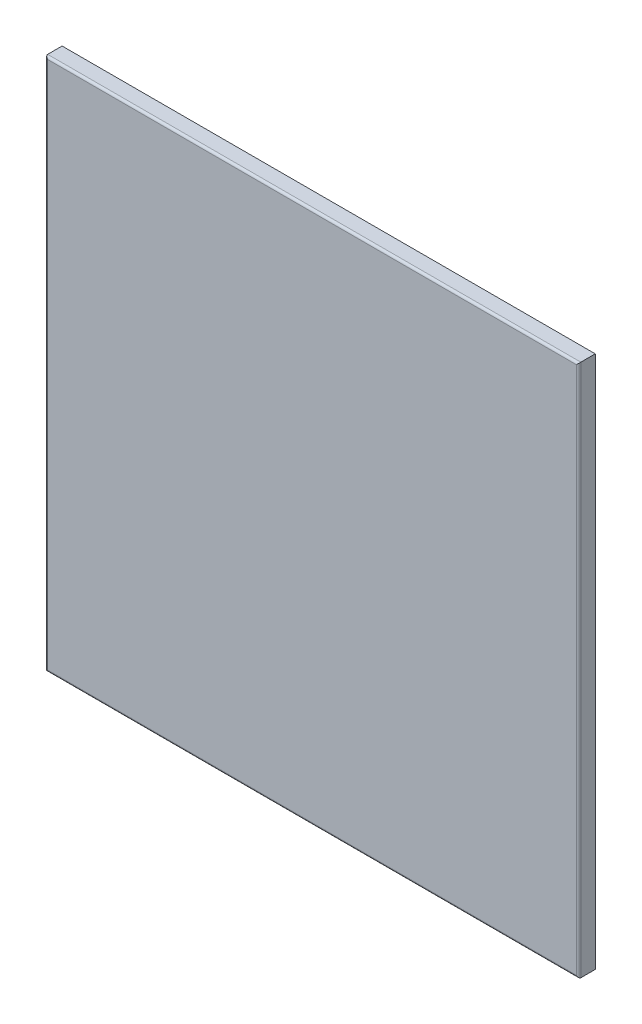
ISO-10303-21;
HEADER;
FILE_DESCRIPTION(('STEP AP214'),'2;1');
FILE_NAME('part.step','',(''),(''),'','','');
FILE_SCHEMA(('AUTOMOTIVE_DESIGN { 1 0 10303 214 1 1 1 1 }'));
ENDSEC;
DATA;
#1=APPLICATION_CONTEXT('core data for automotive mechanical design processes');
#2=APPLICATION_PROTOCOL_DEFINITION('international standard','automotive_design',2000,#1);
#3=PRODUCT_CONTEXT('',#1,'mechanical');
#4=PRODUCT('Part','Part','',(#3));
#5=PRODUCT_RELATED_PRODUCT_CATEGORY('part','',(#4));
#6=PRODUCT_DEFINITION_FORMATION('','',#4);
#7=PRODUCT_DEFINITION_CONTEXT('part definition',#1,'design');
#8=PRODUCT_DEFINITION('design','',#6,#7);
#9=PRODUCT_DEFINITION_SHAPE('','',#8);
#10=(LENGTH_UNIT() NAMED_UNIT(*) SI_UNIT(.MILLI.,.METRE.));
#11=(NAMED_UNIT(*) PLANE_ANGLE_UNIT() SI_UNIT($,.RADIAN.));
#12=(NAMED_UNIT(*) SI_UNIT($,.STERADIAN.) SOLID_ANGLE_UNIT());
#13=UNCERTAINTY_MEASURE_WITH_UNIT(LENGTH_MEASURE(1.E-05),#10,'distance_accuracy_value','');
#14=(GEOMETRIC_REPRESENTATION_CONTEXT(3) GLOBAL_UNCERTAINTY_ASSIGNED_CONTEXT((#13)) GLOBAL_UNIT_ASSIGNED_CONTEXT((#10,
#11,#12)) REPRESENTATION_CONTEXT('',''));
#15=CARTESIAN_POINT('',(0.,0.,0.));
#16=DIRECTION('',(0.,0.,1.));
#17=DIRECTION('',(1.,0.,0.));
#18=AXIS2_PLACEMENT_3D('',#15,#16,#17);
#19=CARTESIAN_POINT('',(304.8,304.8,2.54));
#20=DIRECTION('',(-1.,0.,0.));
#21=DIRECTION('',(0.,-1.,0.));
#22=AXIS2_PLACEMENT_3D('',#19,#20,#21);
#23=PLANE('',#22);
#24=DIRECTION('',(0.,0.,-1.));
#25=VECTOR('',#24,1.);
#26=CARTESIAN_POINT('',(304.8,304.8,2.54));
#27=LINE('',#26,#25);
#28=CARTESIAN_POINT('',(304.8,304.8,0.));
#29=VERTEX_POINT('',#28);
#30=CARTESIAN_POINT('',(304.8,304.8,-16.51));
#31=VERTEX_POINT('',#30);
#32=EDGE_CURVE('E167',#29,#31,#27,.T.);
#33=ORIENTED_EDGE('',*,*,#32,.F.);
#34=DIRECTION('',(0.,1.,0.));
#35=VECTOR('',#34,1.);
#36=CARTESIAN_POINT('',(304.8,-304.8,0.));
#37=LINE('',#36,#35);
#38=CARTESIAN_POINT('',(304.8,-304.8,0.));
#39=VERTEX_POINT('',#38);
#40=EDGE_CURVE('E11',#29,#39,#37,.F.);
#41=ORIENTED_EDGE('',*,*,#40,.T.);
#42=DIRECTION('',(0.,0.,-1.));
#43=VECTOR('',#42,1.);
#44=CARTESIAN_POINT('',(304.8,-304.8,2.54));
#45=LINE('',#44,#43);
#46=CARTESIAN_POINT('',(304.8,-304.8,-16.51));
#47=VERTEX_POINT('',#46);
#48=EDGE_CURVE('E161',#39,#47,#45,.T.);
#49=ORIENTED_EDGE('',*,*,#48,.T.);
#50=DIRECTION('',(0.,1.,0.));
#51=VECTOR('',#50,1.);
#52=CARTESIAN_POINT('',(304.8,-304.8,-16.51));
#53=LINE('',#52,#51);
#54=EDGE_CURVE('E152',#47,#31,#53,.T.);
#55=ORIENTED_EDGE('',*,*,#54,.T.);
#56=EDGE_LOOP('',(#33,#41,#49,#55));
#57=FACE_BOUND('',#56,.T.);
#58=ADVANCED_FACE('F33',(#57),#23,.F.);
#59=CARTESIAN_POINT('',(-304.8,304.8,2.54));
#60=DIRECTION('',(0.,-1.,0.));
#61=DIRECTION('',(0.,0.,-1.));
#62=AXIS2_PLACEMENT_3D('',#59,#60,#61);
#63=PLANE('',#62);
#64=DIRECTION('',(0.,0.,-1.));
#65=VECTOR('',#64,1.);
#66=CARTESIAN_POINT('',(-304.8,304.8,2.54));
#67=LINE('',#66,#65);
#68=CARTESIAN_POINT('',(-304.8,304.8,0.));
#69=VERTEX_POINT('',#68);
#70=CARTESIAN_POINT('',(-304.8,304.8,-16.51));
#71=VERTEX_POINT('',#70);
#72=EDGE_CURVE('E165',#69,#71,#67,.T.);
#73=ORIENTED_EDGE('',*,*,#72,.F.);
#74=DIRECTION('',(-1.,0.,0.));
#75=VECTOR('',#74,1.);
#76=CARTESIAN_POINT('',(304.8,304.8,0.));
#77=LINE('',#76,#75);
#78=EDGE_CURVE('E42',#69,#29,#77,.F.);
#79=ORIENTED_EDGE('',*,*,#78,.T.);
#80=ORIENTED_EDGE('',*,*,#32,.T.);
#81=DIRECTION('',(-1.,0.,0.));
#82=VECTOR('',#81,1.);
#83=CARTESIAN_POINT('',(304.8,304.8,-16.51));
#84=LINE('',#83,#82);
#85=EDGE_CURVE('E155',#31,#71,#84,.T.);
#86=ORIENTED_EDGE('',*,*,#85,.T.);
#87=EDGE_LOOP('',(#73,#79,#80,#86));
#88=FACE_BOUND('',#87,.T.);
#89=ADVANCED_FACE('F222',(#88),#63,.F.);
#90=CARTESIAN_POINT('',(-304.8,304.8,2.54));
#91=DIRECTION('',(1.,0.,0.));
#92=DIRECTION('',(0.,0.,-1.));
#93=AXIS2_PLACEMENT_3D('',#90,#91,#92);
#94=PLANE('',#93);
#95=DIRECTION('',(0.,0.,-1.));
#96=VECTOR('',#95,1.);
#97=CARTESIAN_POINT('',(-304.8,-304.8,2.54));
#98=LINE('',#97,#96);
#99=CARTESIAN_POINT('',(-304.8,-304.8,0.));
#100=VERTEX_POINT('',#99);
#101=CARTESIAN_POINT('',(-304.8,-304.8,-16.51));
#102=VERTEX_POINT('',#101);
#103=EDGE_CURVE('E163',#100,#102,#98,.T.);
#104=ORIENTED_EDGE('',*,*,#103,.F.);
#105=DIRECTION('',(0.,-1.,0.));
#106=VECTOR('',#105,1.);
#107=CARTESIAN_POINT('',(-304.8,304.8,0.));
#108=LINE('',#107,#106);
#109=EDGE_CURVE('E57',#100,#69,#108,.F.);
#110=ORIENTED_EDGE('',*,*,#109,.T.);
#111=ORIENTED_EDGE('',*,*,#72,.T.);
#112=DIRECTION('',(0.,-1.,0.));
#113=VECTOR('',#112,1.);
#114=CARTESIAN_POINT('',(-304.8,304.8,-16.51));
#115=LINE('',#114,#113);
#116=EDGE_CURVE('E158',#71,#102,#115,.T.);
#117=ORIENTED_EDGE('',*,*,#116,.T.);
#118=EDGE_LOOP('',(#104,#110,#111,#117));
#119=FACE_BOUND('',#118,.T.);
#120=ADVANCED_FACE('F217',(#119),#94,.F.);
#121=CARTESIAN_POINT('',(-304.8,-304.8,2.54));
#122=DIRECTION('',(0.,1.,0.));
#123=DIRECTION('',(0.,0.,1.));
#124=AXIS2_PLACEMENT_3D('',#121,#122,#123);
#125=PLANE('',#124);
#126=ORIENTED_EDGE('',*,*,#48,.F.);
#127=DIRECTION('',(1.,0.,0.));
#128=VECTOR('',#127,1.);
#129=CARTESIAN_POINT('',(-304.8,-304.8,0.));
#130=LINE('',#129,#128);
#131=EDGE_CURVE('E187',#39,#100,#130,.F.);
#132=ORIENTED_EDGE('',*,*,#131,.T.);
#133=ORIENTED_EDGE('',*,*,#103,.T.);
#134=DIRECTION('',(1.,0.,0.));
#135=VECTOR('',#134,1.);
#136=CARTESIAN_POINT('',(-304.8,-304.8,-16.51));
#137=LINE('',#136,#135);
#138=EDGE_CURVE('E145',#102,#47,#137,.T.);
#139=ORIENTED_EDGE('',*,*,#138,.T.);
#140=EDGE_LOOP('',(#126,#132,#133,#139));
#141=FACE_BOUND('',#140,.T.);
#142=ADVANCED_FACE('F215',(#141),#125,.F.);
#143=CARTESIAN_POINT('',(0.,0.,2.54));
#144=DIRECTION('',(0.,0.,1.));
#145=DIRECTION('',(1.,0.,0.));
#146=AXIS2_PLACEMENT_3D('',#143,#144,#145);
#147=PLANE('',#146);
#148=DIRECTION('',(0.,-1.,0.));
#149=VECTOR('',#148,1.);
#150=CARTESIAN_POINT('',(-302.26,-304.8,2.54));
#151=LINE('',#150,#149);
#152=CARTESIAN_POINT('',(-302.26,302.26,2.54));
#153=VERTEX_POINT('',#152);
#154=CARTESIAN_POINT('',(-302.26,-302.26,2.54));
#155=VERTEX_POINT('',#154);
#156=EDGE_CURVE('E182',#153,#155,#151,.T.);
#157=ORIENTED_EDGE('',*,*,#156,.T.);
#158=DIRECTION('',(1.,0.,0.));
#159=VECTOR('',#158,1.);
#160=CARTESIAN_POINT('',(304.8,-302.26,2.54));
#161=LINE('',#160,#159);
#162=CARTESIAN_POINT('',(302.26,-302.26,2.54));
#163=VERTEX_POINT('',#162);
#164=EDGE_CURVE('E184',#155,#163,#161,.T.);
#165=ORIENTED_EDGE('',*,*,#164,.T.);
#166=DIRECTION('',(0.,1.,0.));
#167=VECTOR('',#166,1.);
#168=CARTESIAN_POINT('',(302.26,304.8,2.54));
#169=LINE('',#168,#167);
#170=CARTESIAN_POINT('',(302.26,302.26,2.54));
#171=VERTEX_POINT('',#170);
#172=EDGE_CURVE('E178',#163,#171,#169,.T.);
#173=ORIENTED_EDGE('',*,*,#172,.T.);
#174=DIRECTION('',(-1.,0.,0.));
#175=VECTOR('',#174,1.);
#176=CARTESIAN_POINT('',(-304.8,302.26,2.54));
#177=LINE('',#176,#175);
#178=EDGE_CURVE('E180',#171,#153,#177,.T.);
#179=ORIENTED_EDGE('',*,*,#178,.T.);
#180=EDGE_LOOP('',(#157,#165,#173,#179));
#181=FACE_BOUND('',#180,.T.);
#182=ADVANCED_FACE('F207',(#181),#147,.T.);
#183=CARTESIAN_POINT('',(302.26,-302.26,-16.51));
#184=DIRECTION('',(1.,0.,0.));
#185=DIRECTION('',(0.,0.,-1.));
#186=AXIS2_PLACEMENT_3D('',#183,#184,#185);
#187=PLANE('',#186);
#188=DIRECTION('',(0.,0.,1.));
#189=VECTOR('',#188,1.);
#190=CARTESIAN_POINT('',(302.26,-302.26,-16.51));
#191=LINE('',#190,#189);
#192=CARTESIAN_POINT('',(302.26,-302.26,-16.51));
#193=VERTEX_POINT('',#192);
#194=CARTESIAN_POINT('',(302.26,-302.26,0.));
#195=VERTEX_POINT('',#194);
#196=EDGE_CURVE('E143',#193,#195,#191,.T.);
#197=ORIENTED_EDGE('',*,*,#196,.T.);
#198=DIRECTION('',(0.,1.,0.));
#199=VECTOR('',#198,1.);
#200=CARTESIAN_POINT('',(302.26,0.,0.));
#201=LINE('',#200,#199);
#202=CARTESIAN_POINT('',(302.26,302.26,0.));
#203=VERTEX_POINT('',#202);
#204=EDGE_CURVE('E119',#195,#203,#201,.T.);
#205=ORIENTED_EDGE('',*,*,#204,.T.);
#206=DIRECTION('',(0.,0.,1.));
#207=VECTOR('',#206,1.);
#208=CARTESIAN_POINT('',(302.26,302.26,-16.51));
#209=LINE('',#208,#207);
#210=CARTESIAN_POINT('',(302.26,302.26,-16.51));
#211=VERTEX_POINT('',#210);
#212=EDGE_CURVE('E112',#211,#203,#209,.T.);
#213=ORIENTED_EDGE('',*,*,#212,.F.);
#214=DIRECTION('',(0.,1.,0.));
#215=VECTOR('',#214,1.);
#216=CARTESIAN_POINT('',(302.26,-302.26,-16.51));
#217=LINE('',#216,#215);
#218=EDGE_CURVE('E117',#193,#211,#217,.T.);
#219=ORIENTED_EDGE('',*,*,#218,.F.);
#220=EDGE_LOOP('',(#197,#205,#213,#219));
#221=FACE_BOUND('',#220,.T.);
#222=ADVANCED_FACE('F115',(#221),#187,.F.);
#223=CARTESIAN_POINT('',(-302.26,-302.26,-16.51));
#224=DIRECTION('',(0.,-1.,0.));
#225=DIRECTION('',(0.,0.,-1.));
#226=AXIS2_PLACEMENT_3D('',#223,#224,#225);
#227=PLANE('',#226);
#228=DIRECTION('',(0.,0.,1.));
#229=VECTOR('',#228,1.);
#230=CARTESIAN_POINT('',(-302.26,-302.26,-16.51));
#231=LINE('',#230,#229);
#232=CARTESIAN_POINT('',(-302.26,-302.26,-16.51));
#233=VERTEX_POINT('',#232);
#234=CARTESIAN_POINT('',(-302.26,-302.26,0.));
#235=VERTEX_POINT('',#234);
#236=EDGE_CURVE('E146',#233,#235,#231,.T.);
#237=ORIENTED_EDGE('',*,*,#236,.T.);
#238=DIRECTION('',(1.,0.,0.));
#239=VECTOR('',#238,1.);
#240=CARTESIAN_POINT('',(0.,-302.26,0.));
#241=LINE('',#240,#239);
#242=EDGE_CURVE('E174',#235,#195,#241,.T.);
#243=ORIENTED_EDGE('',*,*,#242,.T.);
#244=ORIENTED_EDGE('',*,*,#196,.F.);
#245=DIRECTION('',(1.,0.,0.));
#246=VECTOR('',#245,1.);
#247=CARTESIAN_POINT('',(-302.26,-302.26,-16.51));
#248=LINE('',#247,#246);
#249=EDGE_CURVE('E123',#233,#193,#248,.T.);
#250=ORIENTED_EDGE('',*,*,#249,.F.);
#251=EDGE_LOOP('',(#237,#243,#244,#250));
#252=FACE_BOUND('',#251,.T.);
#253=ADVANCED_FACE('F260',(#252),#227,.F.);
#254=CARTESIAN_POINT('',(-302.26,302.26,-16.51));
#255=DIRECTION('',(-1.,0.,0.));
#256=DIRECTION('',(0.,0.,1.));
#257=AXIS2_PLACEMENT_3D('',#254,#255,#256);
#258=PLANE('',#257);
#259=DIRECTION('',(0.,0.,1.));
#260=VECTOR('',#259,1.);
#261=CARTESIAN_POINT('',(-302.26,302.26,-16.51));
#262=LINE('',#261,#260);
#263=CARTESIAN_POINT('',(-302.26,302.26,-16.51));
#264=VERTEX_POINT('',#263);
#265=CARTESIAN_POINT('',(-302.26,302.26,0.));
#266=VERTEX_POINT('',#265);
#267=EDGE_CURVE('E122',#264,#266,#262,.T.);
#268=ORIENTED_EDGE('',*,*,#267,.T.);
#269=DIRECTION('',(0.,-1.,0.));
#270=VECTOR('',#269,1.);
#271=CARTESIAN_POINT('',(-302.26,0.,0.));
#272=LINE('',#271,#270);
#273=EDGE_CURVE('E171',#266,#235,#272,.T.);
#274=ORIENTED_EDGE('',*,*,#273,.T.);
#275=ORIENTED_EDGE('',*,*,#236,.F.);
#276=DIRECTION('',(0.,-1.,0.));
#277=VECTOR('',#276,1.);
#278=CARTESIAN_POINT('',(-302.26,302.26,-16.51));
#279=LINE('',#278,#277);
#280=EDGE_CURVE('E132',#264,#233,#279,.T.);
#281=ORIENTED_EDGE('',*,*,#280,.F.);
#282=EDGE_LOOP('',(#268,#274,#275,#281));
#283=FACE_BOUND('',#282,.T.);
#284=ADVANCED_FACE('F265',(#283),#258,.F.);
#285=CARTESIAN_POINT('',(302.26,302.26,-16.51));
#286=DIRECTION('',(0.,1.,0.));
#287=DIRECTION('',(0.,0.,1.));
#288=AXIS2_PLACEMENT_3D('',#285,#286,#287);
#289=PLANE('',#288);
#290=ORIENTED_EDGE('',*,*,#212,.T.);
#291=DIRECTION('',(-1.,0.,0.));
#292=VECTOR('',#291,1.);
#293=CARTESIAN_POINT('',(0.,302.26,0.));
#294=LINE('',#293,#292);
#295=EDGE_CURVE('E169',#203,#266,#294,.T.);
#296=ORIENTED_EDGE('',*,*,#295,.T.);
#297=ORIENTED_EDGE('',*,*,#267,.F.);
#298=DIRECTION('',(-1.,0.,0.));
#299=VECTOR('',#298,1.);
#300=CARTESIAN_POINT('',(302.26,302.26,-16.51));
#301=LINE('',#300,#299);
#302=EDGE_CURVE('E127',#211,#264,#301,.T.);
#303=ORIENTED_EDGE('',*,*,#302,.F.);
#304=EDGE_LOOP('',(#290,#296,#297,#303));
#305=FACE_BOUND('',#304,.T.);
#306=ADVANCED_FACE('F128',(#305),#289,.F.);
#307=CARTESIAN_POINT('',(0.,0.,-16.51));
#308=DIRECTION('',(0.,0.,1.));
#309=DIRECTION('',(1.,0.,0.));
#310=AXIS2_PLACEMENT_3D('',#307,#308,#309);
#311=PLANE('',#310);
#312=ORIENTED_EDGE('',*,*,#249,.T.);
#313=ORIENTED_EDGE('',*,*,#218,.T.);
#314=ORIENTED_EDGE('',*,*,#302,.T.);
#315=ORIENTED_EDGE('',*,*,#280,.T.);
#316=EDGE_LOOP('',(#312,#313,#314,#315));
#317=FACE_BOUND('',#316,.T.);
#318=ORIENTED_EDGE('',*,*,#138,.F.);
#319=ORIENTED_EDGE('',*,*,#116,.F.);
#320=ORIENTED_EDGE('',*,*,#85,.F.);
#321=ORIENTED_EDGE('',*,*,#54,.F.);
#322=EDGE_LOOP('',(#318,#319,#320,#321));
#323=FACE_BOUND('',#322,.T.);
#324=ADVANCED_FACE('F134',(#317,#323),#311,.F.);
#325=CARTESIAN_POINT('',(0.,0.,0.));
#326=DIRECTION('',(0.,0.,1.));
#327=DIRECTION('',(1.,0.,0.));
#328=AXIS2_PLACEMENT_3D('',#325,#326,#327);
#329=PLANE('',#328);
#330=ORIENTED_EDGE('',*,*,#204,.F.);
#331=ORIENTED_EDGE('',*,*,#242,.F.);
#332=ORIENTED_EDGE('',*,*,#273,.F.);
#333=ORIENTED_EDGE('',*,*,#295,.F.);
#334=EDGE_LOOP('',(#330,#331,#332,#333));
#335=FACE_BOUND('',#334,.T.);
#336=ADVANCED_FACE('F242',(#335),#329,.F.);
#337=CARTESIAN_POINT('',(0.,302.26,0.));
#338=DIRECTION('',(1.,0.,0.));
#339=DIRECTION('',(0.,0.,-1.));
#340=AXIS2_PLACEMENT_3D('',#337,#338,#339);
#341=CYLINDRICAL_SURFACE('',#340,2.54);
#342=CARTESIAN_POINT('',(302.26,302.26,0.));
#343=DIRECTION('',(0.707106781186548,-0.707106781186547,0.));
#344=DIRECTION('',(-0.707106781186547,-0.707106781186548,0.));
#345=AXIS2_PLACEMENT_3D('',#342,#343,#344);
#346=ELLIPSE('',#345,3.59210244842766,2.54);
#347=EDGE_CURVE('E139',#29,#171,#346,.T.);
#348=ORIENTED_EDGE('',*,*,#347,.F.);
#349=ORIENTED_EDGE('',*,*,#78,.F.);
#350=CARTESIAN_POINT('',(-302.26,302.26,0.));
#351=DIRECTION('',(0.707106781186547,0.707106781186547,0.));
#352=DIRECTION('',(0.707106781186547,-0.707106781186547,0.));
#353=AXIS2_PLACEMENT_3D('',#350,#351,#352);
#354=ELLIPSE('',#353,3.59210244842766,2.54);
#355=EDGE_CURVE('E37',#153,#69,#354,.F.);
#356=ORIENTED_EDGE('',*,*,#355,.F.);
#357=ORIENTED_EDGE('',*,*,#178,.F.);
#358=EDGE_LOOP('',(#348,#349,#356,#357));
#359=FACE_BOUND('',#358,.T.);
#360=ADVANCED_FACE('F35',(#359),#341,.T.);
#361=CARTESIAN_POINT('',(-302.26,0.,0.));
#362=DIRECTION('',(0.,1.,0.));
#363=DIRECTION('',(0.,0.,1.));
#364=AXIS2_PLACEMENT_3D('',#361,#362,#363);
#365=CYLINDRICAL_SURFACE('',#364,2.54);
#366=ORIENTED_EDGE('',*,*,#355,.T.);
#367=ORIENTED_EDGE('',*,*,#109,.F.);
#368=CARTESIAN_POINT('',(-302.26,-302.26,0.));
#369=DIRECTION('',(-0.707106781186547,0.707106781186547,0.));
#370=DIRECTION('',(0.707106781186547,0.707106781186547,0.));
#371=AXIS2_PLACEMENT_3D('',#368,#369,#370);
#372=ELLIPSE('',#371,3.59210244842766,2.54);
#373=EDGE_CURVE('E194',#155,#100,#372,.F.);
#374=ORIENTED_EDGE('',*,*,#373,.F.);
#375=ORIENTED_EDGE('',*,*,#156,.F.);
#376=EDGE_LOOP('',(#366,#367,#374,#375));
#377=FACE_BOUND('',#376,.T.);
#378=ADVANCED_FACE('F236',(#377),#365,.T.);
#379=CARTESIAN_POINT('',(302.26,0.,0.));
#380=DIRECTION('',(0.,-1.,0.));
#381=DIRECTION('',(1.,0.,0.));
#382=AXIS2_PLACEMENT_3D('',#379,#380,#381);
#383=CYLINDRICAL_SURFACE('',#382,2.54);
#384=ORIENTED_EDGE('',*,*,#347,.T.);
#385=ORIENTED_EDGE('',*,*,#172,.F.);
#386=CARTESIAN_POINT('',(302.26,-302.26,0.));
#387=DIRECTION('',(-0.707106781186547,-0.707106781186548,0.));
#388=DIRECTION('',(0.707106781186548,-0.707106781186547,0.));
#389=AXIS2_PLACEMENT_3D('',#386,#387,#388);
#390=ELLIPSE('',#389,3.59210244842766,2.54);
#391=EDGE_CURVE('E192',#39,#163,#390,.T.);
#392=ORIENTED_EDGE('',*,*,#391,.F.);
#393=ORIENTED_EDGE('',*,*,#40,.F.);
#394=EDGE_LOOP('',(#384,#385,#392,#393));
#395=FACE_BOUND('',#394,.T.);
#396=ADVANCED_FACE('F200',(#395),#383,.T.);
#397=CARTESIAN_POINT('',(0.,-302.26,0.));
#398=DIRECTION('',(-1.,0.,0.));
#399=DIRECTION('',(0.,0.,1.));
#400=AXIS2_PLACEMENT_3D('',#397,#398,#399);
#401=CYLINDRICAL_SURFACE('',#400,2.54);
#402=ORIENTED_EDGE('',*,*,#373,.T.);
#403=ORIENTED_EDGE('',*,*,#131,.F.);
#404=ORIENTED_EDGE('',*,*,#391,.T.);
#405=ORIENTED_EDGE('',*,*,#164,.F.);
#406=EDGE_LOOP('',(#402,#403,#404,#405));
#407=FACE_BOUND('',#406,.T.);
#408=ADVANCED_FACE('F211',(#407),#401,.T.);
#409=CLOSED_SHELL('',(#58,#89,#120,#142,#182,#222,#253,#284,#306,#324,#336,#360,#378,#396,#408));
#410=MANIFOLD_SOLID_BREP('B2',#409);
#411=ADVANCED_BREP_SHAPE_REPRESENTATION('',(#18,#410),#14);
#412=SHAPE_DEFINITION_REPRESENTATION(#9,#411);
ENDSEC;
END-ISO-10303-21;
